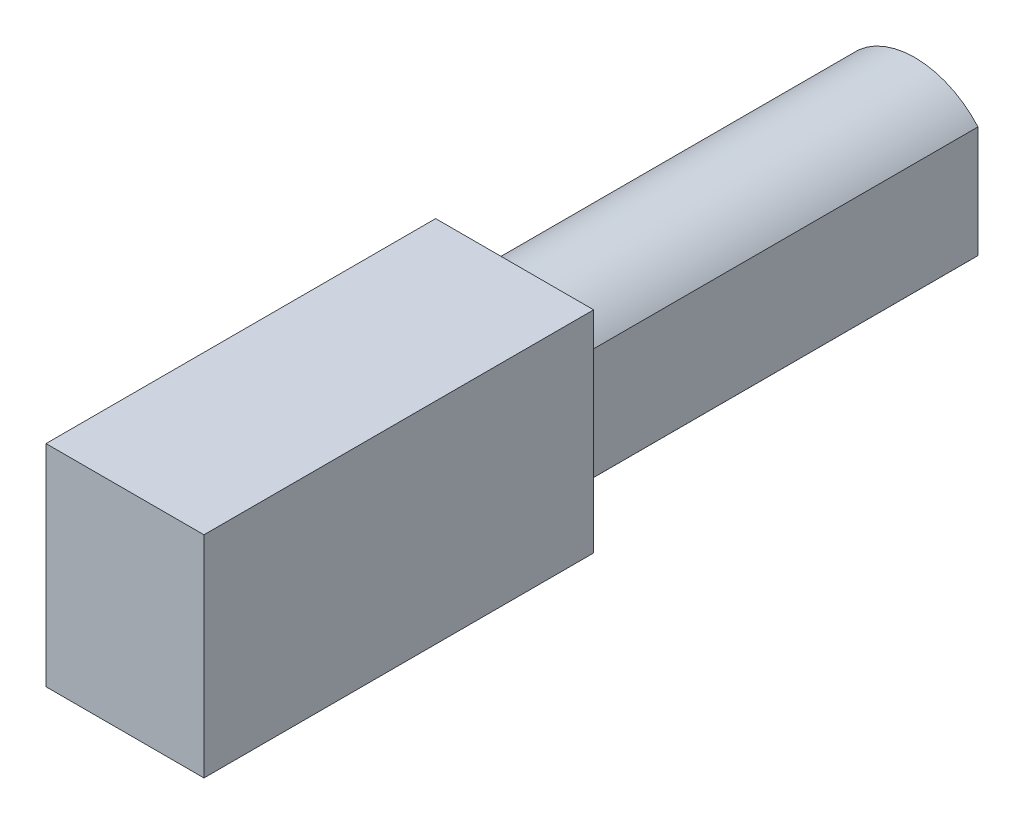
ISO-10303-21;
HEADER;
FILE_DESCRIPTION(('STEP AP214'),'2;1');
FILE_NAME('part.step','',(''),(''),'','','');
FILE_SCHEMA(('AUTOMOTIVE_DESIGN { 1 0 10303 214 1 1 1 1 }'));
ENDSEC;
DATA;
#1=APPLICATION_CONTEXT('core data for automotive mechanical design processes');
#2=APPLICATION_PROTOCOL_DEFINITION('international standard','automotive_design',2000,#1);
#3=PRODUCT_CONTEXT('',#1,'mechanical');
#4=PRODUCT('Part','Part','',(#3));
#5=PRODUCT_RELATED_PRODUCT_CATEGORY('part','',(#4));
#6=PRODUCT_DEFINITION_FORMATION('','',#4);
#7=PRODUCT_DEFINITION_CONTEXT('part definition',#1,'design');
#8=PRODUCT_DEFINITION('design','',#6,#7);
#9=PRODUCT_DEFINITION_SHAPE('','',#8);
#10=(LENGTH_UNIT() NAMED_UNIT(*) SI_UNIT(.MILLI.,.METRE.));
#11=(NAMED_UNIT(*) PLANE_ANGLE_UNIT() SI_UNIT($,.RADIAN.));
#12=(NAMED_UNIT(*) SI_UNIT($,.STERADIAN.) SOLID_ANGLE_UNIT());
#13=UNCERTAINTY_MEASURE_WITH_UNIT(LENGTH_MEASURE(1.E-05),#10,'distance_accuracy_value','');
#14=(GEOMETRIC_REPRESENTATION_CONTEXT(3) GLOBAL_UNCERTAINTY_ASSIGNED_CONTEXT((#13)) GLOBAL_UNIT_ASSIGNED_CONTEXT((#10,
#11,#12)) REPRESENTATION_CONTEXT('',''));
#15=CARTESIAN_POINT('',(0.,0.,0.));
#16=DIRECTION('',(0.,0.,1.));
#17=DIRECTION('',(1.,0.,0.));
#18=AXIS2_PLACEMENT_3D('',#15,#16,#17);
#19=CARTESIAN_POINT('',(0.,0.,38.));
#20=DIRECTION('',(0.,0.,-1.));
#21=DIRECTION('',(-1.,0.,0.));
#22=AXIS2_PLACEMENT_3D('',#19,#20,#21);
#23=CYLINDRICAL_SURFACE('',#22,8.);
#24=CARTESIAN_POINT('',(0.,0.,0.));
#25=DIRECTION('',(0.,0.,1.));
#26=DIRECTION('',(1.,0.,0.));
#27=AXIS2_PLACEMENT_3D('',#24,#25,#26);
#28=CIRCLE('',#27,8.);
#29=CARTESIAN_POINT('',(6.,5.29150262212918,0.));
#30=VERTEX_POINT('',#29);
#31=CARTESIAN_POINT('',(-6.,5.29150262212918,0.));
#32=VERTEX_POINT('',#31);
#33=EDGE_CURVE('E131',#30,#32,#28,.T.);
#34=ORIENTED_EDGE('',*,*,#33,.T.);
#35=DIRECTION('',(0.,0.,-1.));
#36=VECTOR('',#35,1.);
#37=CARTESIAN_POINT('',(-6.,5.29150262212918,38.));
#38=LINE('',#37,#36);
#39=CARTESIAN_POINT('',(-6.,5.29150262212918,38.));
#40=VERTEX_POINT('',#39);
#41=EDGE_CURVE('E11',#40,#32,#38,.T.);
#42=ORIENTED_EDGE('',*,*,#41,.F.);
#43=CARTESIAN_POINT('',(0.,0.,38.));
#44=DIRECTION('',(0.,0.,1.));
#45=DIRECTION('',(1.,0.,0.));
#46=AXIS2_PLACEMENT_3D('',#43,#44,#45);
#47=CIRCLE('',#46,8.);
#48=CARTESIAN_POINT('',(6.,5.29150262212918,38.));
#49=VERTEX_POINT('',#48);
#50=EDGE_CURVE('E140',#49,#40,#47,.T.);
#51=ORIENTED_EDGE('',*,*,#50,.F.);
#52=DIRECTION('',(0.,0.,-1.));
#53=VECTOR('',#52,1.);
#54=CARTESIAN_POINT('',(6.,5.29150262212918,38.));
#55=LINE('',#54,#53);
#56=EDGE_CURVE('E149',#49,#30,#55,.T.);
#57=ORIENTED_EDGE('',*,*,#56,.T.);
#58=EDGE_LOOP('',(#34,#42,#51,#57));
#59=FACE_BOUND('',#58,.T.);
#60=ADVANCED_FACE('F33',(#59),#23,.T.);
#61=CARTESIAN_POINT('',(-6.,-5.29150262212918,38.));
#62=DIRECTION('',(1.,0.,0.));
#63=DIRECTION('',(0.,0.,-1.));
#64=AXIS2_PLACEMENT_3D('',#61,#62,#63);
#65=PLANE('',#64);
#66=DIRECTION('',(0.,-1.,0.));
#67=VECTOR('',#66,1.);
#68=CARTESIAN_POINT('',(-6.,-5.29150262212918,0.));
#69=LINE('',#68,#67);
#70=CARTESIAN_POINT('',(-6.,-5.29150262212918,0.));
#71=VERTEX_POINT('',#70);
#72=EDGE_CURVE('E134',#32,#71,#69,.T.);
#73=ORIENTED_EDGE('',*,*,#72,.T.);
#74=DIRECTION('',(0.,0.,-1.));
#75=VECTOR('',#74,1.);
#76=CARTESIAN_POINT('',(-6.,-5.29150262212918,38.));
#77=LINE('',#76,#75);
#78=CARTESIAN_POINT('',(-6.,-5.29150262212918,38.));
#79=VERTEX_POINT('',#78);
#80=EDGE_CURVE('E41',#79,#71,#77,.T.);
#81=ORIENTED_EDGE('',*,*,#80,.F.);
#82=DIRECTION('',(0.,-1.,0.));
#83=VECTOR('',#82,1.);
#84=CARTESIAN_POINT('',(-6.,-5.29150262212918,38.));
#85=LINE('',#84,#83);
#86=EDGE_CURVE('E75',#40,#79,#85,.T.);
#87=ORIENTED_EDGE('',*,*,#86,.F.);
#88=ORIENTED_EDGE('',*,*,#41,.T.);
#89=EDGE_LOOP('',(#73,#81,#87,#88));
#90=FACE_BOUND('',#89,.T.);
#91=ADVANCED_FACE('F203',(#90),#65,.F.);
#92=CARTESIAN_POINT('',(0.,0.,38.));
#93=DIRECTION('',(0.,0.,-1.));
#94=DIRECTION('',(-1.,0.,0.));
#95=AXIS2_PLACEMENT_3D('',#92,#93,#94);
#96=CYLINDRICAL_SURFACE('',#95,8.);
#97=CARTESIAN_POINT('',(0.,0.,0.));
#98=DIRECTION('',(0.,0.,1.));
#99=DIRECTION('',(1.,0.,0.));
#100=AXIS2_PLACEMENT_3D('',#97,#98,#99);
#101=CIRCLE('',#100,8.);
#102=CARTESIAN_POINT('',(6.,-5.29150262212918,0.));
#103=VERTEX_POINT('',#102);
#104=EDGE_CURVE('E65',#71,#103,#101,.T.);
#105=ORIENTED_EDGE('',*,*,#104,.T.);
#106=DIRECTION('',(0.,0.,-1.));
#107=VECTOR('',#106,1.);
#108=CARTESIAN_POINT('',(6.,-5.29150262212918,38.));
#109=LINE('',#108,#107);
#110=CARTESIAN_POINT('',(6.,-5.29150262212918,38.));
#111=VERTEX_POINT('',#110);
#112=EDGE_CURVE('E49',#111,#103,#109,.T.);
#113=ORIENTED_EDGE('',*,*,#112,.F.);
#114=CARTESIAN_POINT('',(0.,0.,38.));
#115=DIRECTION('',(0.,0.,1.));
#116=DIRECTION('',(1.,0.,0.));
#117=AXIS2_PLACEMENT_3D('',#114,#115,#116);
#118=CIRCLE('',#117,8.);
#119=EDGE_CURVE('E144',#79,#111,#118,.T.);
#120=ORIENTED_EDGE('',*,*,#119,.F.);
#121=ORIENTED_EDGE('',*,*,#80,.T.);
#122=EDGE_LOOP('',(#105,#113,#120,#121));
#123=FACE_BOUND('',#122,.T.);
#124=ADVANCED_FACE('F155',(#123),#96,.T.);
#125=CARTESIAN_POINT('',(6.,-5.29150262212918,38.));
#126=DIRECTION('',(-1.,0.,0.));
#127=DIRECTION('',(0.,0.,1.));
#128=AXIS2_PLACEMENT_3D('',#125,#126,#127);
#129=PLANE('',#128);
#130=DIRECTION('',(0.,1.,0.));
#131=VECTOR('',#130,1.);
#132=CARTESIAN_POINT('',(6.,-5.29150262212918,0.));
#133=LINE('',#132,#131);
#134=EDGE_CURVE('E70',#103,#30,#133,.T.);
#135=ORIENTED_EDGE('',*,*,#134,.T.);
#136=ORIENTED_EDGE('',*,*,#56,.F.);
#137=DIRECTION('',(0.,1.,0.));
#138=VECTOR('',#137,1.);
#139=CARTESIAN_POINT('',(6.,-5.29150262212918,38.));
#140=LINE('',#139,#138);
#141=EDGE_CURVE('E147',#111,#49,#140,.T.);
#142=ORIENTED_EDGE('',*,*,#141,.F.);
#143=ORIENTED_EDGE('',*,*,#112,.T.);
#144=EDGE_LOOP('',(#135,#136,#142,#143));
#145=FACE_BOUND('',#144,.T.);
#146=ADVANCED_FACE('F160',(#145),#129,.F.);
#147=CARTESIAN_POINT('',(0.,0.,0.));
#148=DIRECTION('',(0.,0.,1.));
#149=DIRECTION('',(1.,0.,0.));
#150=AXIS2_PLACEMENT_3D('',#147,#148,#149);
#151=PLANE('',#150);
#152=CARTESIAN_POINT('',(0.,0.,0.));
#153=DIRECTION('',(0.,0.,-1.));
#154=DIRECTION('',(-1.,0.,0.));
#155=AXIS2_PLACEMENT_3D('',#152,#153,#154);
#156=CIRCLE('',#155,4.5);
#157=CARTESIAN_POINT('',(-4.5,0.,0.));
#158=VERTEX_POINT('',#157);
#159=EDGE_CURVE('E175',#158,#158,#156,.T.);
#160=ORIENTED_EDGE('',*,*,#159,.F.);
#161=EDGE_LOOP('',(#160));
#162=FACE_BOUND('',#161,.T.);
#163=ORIENTED_EDGE('',*,*,#33,.F.);
#164=ORIENTED_EDGE('',*,*,#134,.F.);
#165=ORIENTED_EDGE('',*,*,#104,.F.);
#166=ORIENTED_EDGE('',*,*,#72,.F.);
#167=EDGE_LOOP('',(#163,#164,#165,#166));
#168=FACE_BOUND('',#167,.T.);
#169=ADVANCED_FACE('F158',(#162,#168),#151,.F.);
#170=CARTESIAN_POINT('',(7.5,-10.,75.));
#171=DIRECTION('',(-1.,0.,0.));
#172=DIRECTION('',(0.,0.,1.));
#173=AXIS2_PLACEMENT_3D('',#170,#171,#172);
#174=PLANE('',#173);
#175=DIRECTION('',(0.,1.,0.));
#176=VECTOR('',#175,1.);
#177=CARTESIAN_POINT('',(7.5,-10.,38.));
#178=LINE('',#177,#176);
#179=CARTESIAN_POINT('',(7.5,-10.,38.));
#180=VERTEX_POINT('',#179);
#181=CARTESIAN_POINT('',(7.5,10.,38.));
#182=VERTEX_POINT('',#181);
#183=EDGE_CURVE('E130',#180,#182,#178,.T.);
#184=ORIENTED_EDGE('',*,*,#183,.T.);
#185=DIRECTION('',(0.,0.,-1.));
#186=VECTOR('',#185,1.);
#187=CARTESIAN_POINT('',(7.5,10.,75.));
#188=LINE('',#187,#186);
#189=CARTESIAN_POINT('',(7.5,10.,75.));
#190=VERTEX_POINT('',#189);
#191=EDGE_CURVE('E110',#190,#182,#188,.T.);
#192=ORIENTED_EDGE('',*,*,#191,.F.);
#193=DIRECTION('',(0.,1.,0.));
#194=VECTOR('',#193,1.);
#195=CARTESIAN_POINT('',(7.5,-10.,75.));
#196=LINE('',#195,#194);
#197=CARTESIAN_POINT('',(7.5,-10.,75.));
#198=VERTEX_POINT('',#197);
#199=EDGE_CURVE('E117',#198,#190,#196,.T.);
#200=ORIENTED_EDGE('',*,*,#199,.F.);
#201=DIRECTION('',(0.,0.,-1.));
#202=VECTOR('',#201,1.);
#203=CARTESIAN_POINT('',(7.5,-10.,75.));
#204=LINE('',#203,#202);
#205=EDGE_CURVE('E182',#198,#180,#204,.T.);
#206=ORIENTED_EDGE('',*,*,#205,.T.);
#207=EDGE_LOOP('',(#184,#192,#200,#206));
#208=FACE_BOUND('',#207,.T.);
#209=ADVANCED_FACE('F128',(#208),#174,.F.);
#210=CARTESIAN_POINT('',(-7.5,10.,75.));
#211=DIRECTION('',(0.,-1.,0.));
#212=DIRECTION('',(0.,0.,-1.));
#213=AXIS2_PLACEMENT_3D('',#210,#211,#212);
#214=PLANE('',#213);
#215=DIRECTION('',(-1.,0.,0.));
#216=VECTOR('',#215,1.);
#217=CARTESIAN_POINT('',(-7.5,10.,38.));
#218=LINE('',#217,#216);
#219=CARTESIAN_POINT('',(-7.5,10.,38.));
#220=VERTEX_POINT('',#219);
#221=EDGE_CURVE('E169',#182,#220,#218,.T.);
#222=ORIENTED_EDGE('',*,*,#221,.T.);
#223=DIRECTION('',(0.,0.,-1.));
#224=VECTOR('',#223,1.);
#225=CARTESIAN_POINT('',(-7.5,10.,75.));
#226=LINE('',#225,#224);
#227=CARTESIAN_POINT('',(-7.5,10.,75.));
#228=VERTEX_POINT('',#227);
#229=EDGE_CURVE('E113',#228,#220,#226,.T.);
#230=ORIENTED_EDGE('',*,*,#229,.F.);
#231=DIRECTION('',(-1.,0.,0.));
#232=VECTOR('',#231,1.);
#233=CARTESIAN_POINT('',(-7.5,10.,75.));
#234=LINE('',#233,#232);
#235=EDGE_CURVE('E106',#190,#228,#234,.T.);
#236=ORIENTED_EDGE('',*,*,#235,.F.);
#237=ORIENTED_EDGE('',*,*,#191,.T.);
#238=EDGE_LOOP('',(#222,#230,#236,#237));
#239=FACE_BOUND('',#238,.T.);
#240=ADVANCED_FACE('F108',(#239),#214,.F.);
#241=CARTESIAN_POINT('',(-7.5,-10.,75.));
#242=DIRECTION('',(1.,0.,0.));
#243=DIRECTION('',(0.,0.,-1.));
#244=AXIS2_PLACEMENT_3D('',#241,#242,#243);
#245=PLANE('',#244);
#246=DIRECTION('',(0.,-1.,0.));
#247=VECTOR('',#246,1.);
#248=CARTESIAN_POINT('',(-7.5,-10.,38.));
#249=LINE('',#248,#247);
#250=CARTESIAN_POINT('',(-7.5,-10.,38.));
#251=VERTEX_POINT('',#250);
#252=EDGE_CURVE('E172',#220,#251,#249,.T.);
#253=ORIENTED_EDGE('',*,*,#252,.T.);
#254=DIRECTION('',(0.,0.,-1.));
#255=VECTOR('',#254,1.);
#256=CARTESIAN_POINT('',(-7.5,-10.,75.));
#257=LINE('',#256,#255);
#258=CARTESIAN_POINT('',(-7.5,-10.,75.));
#259=VERTEX_POINT('',#258);
#260=EDGE_CURVE('E136',#259,#251,#257,.T.);
#261=ORIENTED_EDGE('',*,*,#260,.F.);
#262=DIRECTION('',(0.,-1.,0.));
#263=VECTOR('',#262,1.);
#264=CARTESIAN_POINT('',(-7.5,-10.,75.));
#265=LINE('',#264,#263);
#266=EDGE_CURVE('E116',#228,#259,#265,.T.);
#267=ORIENTED_EDGE('',*,*,#266,.F.);
#268=ORIENTED_EDGE('',*,*,#229,.T.);
#269=EDGE_LOOP('',(#253,#261,#267,#268));
#270=FACE_BOUND('',#269,.T.);
#271=ADVANCED_FACE('F188',(#270),#245,.F.);
#272=CARTESIAN_POINT('',(-7.5,-10.,75.));
#273=DIRECTION('',(0.,1.,0.));
#274=DIRECTION('',(0.,0.,1.));
#275=AXIS2_PLACEMENT_3D('',#272,#273,#274);
#276=PLANE('',#275);
#277=DIRECTION('',(1.,0.,0.));
#278=VECTOR('',#277,1.);
#279=CARTESIAN_POINT('',(-7.5,-10.,38.));
#280=LINE('',#279,#278);
#281=EDGE_CURVE('E126',#251,#180,#280,.T.);
#282=ORIENTED_EDGE('',*,*,#281,.T.);
#283=ORIENTED_EDGE('',*,*,#205,.F.);
#284=DIRECTION('',(1.,0.,0.));
#285=VECTOR('',#284,1.);
#286=CARTESIAN_POINT('',(-7.5,-10.,75.));
#287=LINE('',#286,#285);
#288=EDGE_CURVE('E122',#259,#198,#287,.T.);
#289=ORIENTED_EDGE('',*,*,#288,.F.);
#290=ORIENTED_EDGE('',*,*,#260,.T.);
#291=EDGE_LOOP('',(#282,#283,#289,#290));
#292=FACE_BOUND('',#291,.T.);
#293=ADVANCED_FACE('F186',(#292),#276,.F.);
#294=CARTESIAN_POINT('',(0.,0.,75.));
#295=DIRECTION('',(0.,0.,-1.));
#296=DIRECTION('',(-1.,0.,0.));
#297=AXIS2_PLACEMENT_3D('',#294,#295,#296);
#298=PLANE('',#297);
#299=ORIENTED_EDGE('',*,*,#199,.T.);
#300=ORIENTED_EDGE('',*,*,#235,.T.);
#301=ORIENTED_EDGE('',*,*,#266,.T.);
#302=ORIENTED_EDGE('',*,*,#288,.T.);
#303=EDGE_LOOP('',(#299,#300,#301,#302));
#304=FACE_BOUND('',#303,.T.);
#305=ADVANCED_FACE('F120',(#304),#298,.F.);
#306=CARTESIAN_POINT('',(0.,0.,38.));
#307=DIRECTION('',(0.,0.,-1.));
#308=DIRECTION('',(-1.,0.,0.));
#309=AXIS2_PLACEMENT_3D('',#306,#307,#308);
#310=PLANE('',#309);
#311=ORIENTED_EDGE('',*,*,#141,.T.);
#312=ORIENTED_EDGE('',*,*,#50,.T.);
#313=ORIENTED_EDGE('',*,*,#86,.T.);
#314=ORIENTED_EDGE('',*,*,#119,.T.);
#315=EDGE_LOOP('',(#311,#312,#313,#314));
#316=FACE_BOUND('',#315,.T.);
#317=ORIENTED_EDGE('',*,*,#183,.F.);
#318=ORIENTED_EDGE('',*,*,#281,.F.);
#319=ORIENTED_EDGE('',*,*,#252,.F.);
#320=ORIENTED_EDGE('',*,*,#221,.F.);
#321=EDGE_LOOP('',(#317,#318,#319,#320));
#322=FACE_BOUND('',#321,.T.);
#323=ADVANCED_FACE('F162',(#316,#322),#310,.T.);
#324=CARTESIAN_POINT('',(0.,0.,30.));
#325=DIRECTION('',(0.,0.,-1.));
#326=DIRECTION('',(-1.,0.,0.));
#327=AXIS2_PLACEMENT_3D('',#324,#325,#326);
#328=CYLINDRICAL_SURFACE('',#327,4.5);
#329=CARTESIAN_POINT('',(0.,0.,30.));
#330=DIRECTION('',(0.,0.,-1.));
#331=DIRECTION('',(-1.,0.,0.));
#332=AXIS2_PLACEMENT_3D('',#329,#330,#331);
#333=CIRCLE('',#332,4.5);
#334=CARTESIAN_POINT('',(-4.5,0.,30.));
#335=VERTEX_POINT('',#334);
#336=EDGE_CURVE('E170',#335,#335,#333,.T.);
#337=ORIENTED_EDGE('',*,*,#336,.F.);
#338=EDGE_LOOP('',(#337));
#339=FACE_BOUND('',#338,.T.);
#340=ORIENTED_EDGE('',*,*,#159,.T.);
#341=EDGE_LOOP('',(#340));
#342=FACE_BOUND('',#341,.T.);
#343=ADVANCED_FACE('F165',(#339,#342),#328,.F.);
#344=CARTESIAN_POINT('',(0.,0.,30.));
#345=DIRECTION('',(0.,0.,-1.));
#346=DIRECTION('',(-1.,0.,0.));
#347=AXIS2_PLACEMENT_3D('',#344,#345,#346);
#348=PLANE('',#347);
#349=ORIENTED_EDGE('',*,*,#336,.T.);
#350=EDGE_LOOP('',(#349));
#351=FACE_BOUND('',#350,.T.);
#352=ADVANCED_FACE('F274',(#351),#348,.T.);
#353=CLOSED_SHELL('',(#60,#91,#124,#146,#169,#209,#240,#271,#293,#305,#323,#343,#352));
#354=MANIFOLD_SOLID_BREP('B2',#353);
#355=ADVANCED_BREP_SHAPE_REPRESENTATION('',(#18,#354),#14);
#356=SHAPE_DEFINITION_REPRESENTATION(#9,#355);
ENDSEC;
END-ISO-10303-21;
